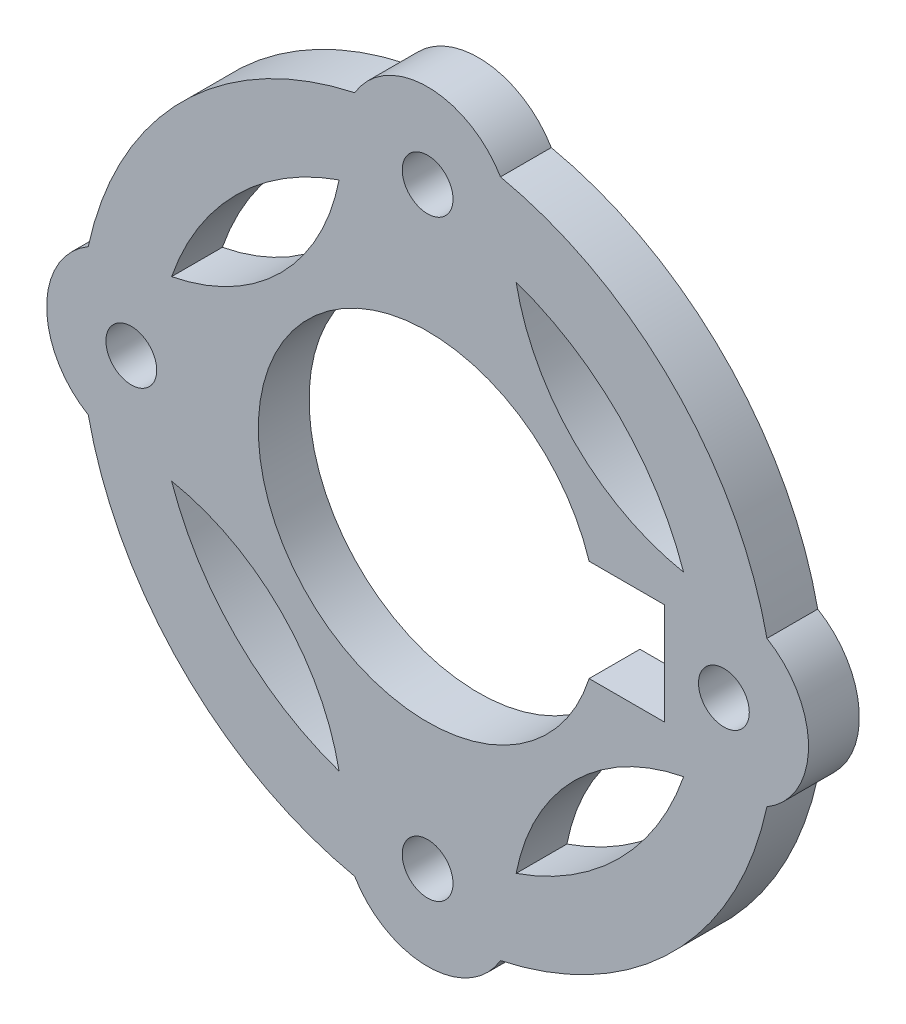
ISO-10303-21;
HEADER;
FILE_DESCRIPTION(('STEP AP214'),'2;1');
FILE_NAME('part.step','',(''),(''),'','','');
FILE_SCHEMA(('AUTOMOTIVE_DESIGN { 1 0 10303 214 1 1 1 1 }'));
ENDSEC;
DATA;
#1=APPLICATION_CONTEXT('core data for automotive mechanical design processes');
#2=APPLICATION_PROTOCOL_DEFINITION('international standard','automotive_design',2000,#1);
#3=PRODUCT_CONTEXT('',#1,'mechanical');
#4=PRODUCT('Part','Part','',(#3));
#5=PRODUCT_RELATED_PRODUCT_CATEGORY('part','',(#4));
#6=PRODUCT_DEFINITION_FORMATION('','',#4);
#7=PRODUCT_DEFINITION_CONTEXT('part definition',#1,'design');
#8=PRODUCT_DEFINITION('design','',#6,#7);
#9=PRODUCT_DEFINITION_SHAPE('','',#8);
#10=(LENGTH_UNIT() NAMED_UNIT(*) SI_UNIT(.MILLI.,.METRE.));
#11=(NAMED_UNIT(*) PLANE_ANGLE_UNIT() SI_UNIT($,.RADIAN.));
#12=(NAMED_UNIT(*) SI_UNIT($,.STERADIAN.) SOLID_ANGLE_UNIT());
#13=UNCERTAINTY_MEASURE_WITH_UNIT(LENGTH_MEASURE(1.E-05),#10,'distance_accuracy_value','');
#14=(GEOMETRIC_REPRESENTATION_CONTEXT(3) GLOBAL_UNCERTAINTY_ASSIGNED_CONTEXT((#13)) GLOBAL_UNIT_ASSIGNED_CONTEXT((#10,
#11,#12)) REPRESENTATION_CONTEXT('',''));
#15=CARTESIAN_POINT('',(0.,0.,0.));
#16=DIRECTION('',(0.,0.,1.));
#17=DIRECTION('',(1.,0.,0.));
#18=AXIS2_PLACEMENT_3D('',#15,#16,#17);
#19=CARTESIAN_POINT('',(0.,0.,3.));
#20=DIRECTION('',(0.,0.,-1.));
#21=DIRECTION('',(-1.,0.,0.));
#22=AXIS2_PLACEMENT_3D('',#19,#20,#21);
#23=CYLINDRICAL_SURFACE('',#22,10.);
#24=DIRECTION('',(0.,0.,-1.));
#25=VECTOR('',#24,1.);
#26=CARTESIAN_POINT('',(9.53939201416946,-3.,3.));
#27=LINE('',#26,#25);
#28=CARTESIAN_POINT('',(9.53939201416946,-3.,0.));
#29=VERTEX_POINT('',#28);
#30=CARTESIAN_POINT('',(9.53939201416946,-3.,3.));
#31=VERTEX_POINT('',#30);
#32=EDGE_CURVE('E539',#29,#31,#27,.F.);
#33=ORIENTED_EDGE('',*,*,#32,.F.);
#34=CARTESIAN_POINT('',(0.,0.,0.));
#35=DIRECTION('',(0.,0.,1.));
#36=DIRECTION('',(1.,0.,0.));
#37=AXIS2_PLACEMENT_3D('',#34,#35,#36);
#38=CIRCLE('',#37,10.);
#39=CARTESIAN_POINT('',(9.53939201416946,3.,0.));
#40=VERTEX_POINT('',#39);
#41=EDGE_CURVE('E470',#40,#29,#38,.T.);
#42=ORIENTED_EDGE('',*,*,#41,.F.);
#43=DIRECTION('',(0.,0.,-1.));
#44=VECTOR('',#43,1.);
#45=CARTESIAN_POINT('',(9.53939201416946,3.,3.));
#46=LINE('',#45,#44);
#47=CARTESIAN_POINT('',(9.53939201416946,3.,3.));
#48=VERTEX_POINT('',#47);
#49=EDGE_CURVE('E706',#48,#40,#46,.T.);
#50=ORIENTED_EDGE('',*,*,#49,.F.);
#51=CARTESIAN_POINT('',(0.,0.,3.));
#52=DIRECTION('',(0.,0.,1.));
#53=DIRECTION('',(1.,0.,0.));
#54=AXIS2_PLACEMENT_3D('',#51,#52,#53);
#55=CIRCLE('',#54,10.);
#56=EDGE_CURVE('E433',#48,#31,#55,.T.);
#57=ORIENTED_EDGE('',*,*,#56,.T.);
#58=EDGE_LOOP('',(#33,#42,#50,#57));
#59=FACE_BOUND('',#58,.T.);
#60=ADVANCED_FACE('F275',(#59),#23,.F.);
#61=CARTESIAN_POINT('',(0.,0.,3.));
#62=DIRECTION('',(0.,0.,-1.));
#63=DIRECTION('',(-1.,0.,0.));
#64=AXIS2_PLACEMENT_3D('',#61,#62,#63);
#65=CYLINDRICAL_SURFACE('',#64,16.);
#66=CARTESIAN_POINT('',(0.,0.,0.));
#67=DIRECTION('',(0.,0.,1.));
#68=DIRECTION('',(1.,0.,0.));
#69=AXIS2_PLACEMENT_3D('',#66,#67,#68);
#70=CIRCLE('',#69,16.);
#71=CARTESIAN_POINT('',(5.22834709121413,-15.1216529087859,0.));
#72=VERTEX_POINT('',#71);
#73=CARTESIAN_POINT('',(15.1216529087859,-5.22834709121412,0.));
#74=VERTEX_POINT('',#73);
#75=EDGE_CURVE('E467',#72,#74,#70,.T.);
#76=ORIENTED_EDGE('',*,*,#75,.F.);
#77=DIRECTION('',(0.,0.,-1.));
#78=VECTOR('',#77,1.);
#79=CARTESIAN_POINT('',(5.22834709121413,-15.1216529087859,3.));
#80=LINE('',#79,#78);
#81=CARTESIAN_POINT('',(5.22834709121413,-15.1216529087859,3.));
#82=VERTEX_POINT('',#81);
#83=EDGE_CURVE('E299',#82,#72,#80,.T.);
#84=ORIENTED_EDGE('',*,*,#83,.F.);
#85=CARTESIAN_POINT('',(0.,0.,3.));
#86=DIRECTION('',(0.,0.,1.));
#87=DIRECTION('',(1.,0.,0.));
#88=AXIS2_PLACEMENT_3D('',#85,#86,#87);
#89=CIRCLE('',#88,16.);
#90=CARTESIAN_POINT('',(15.1216529087859,-5.22834709121412,3.));
#91=VERTEX_POINT('',#90);
#92=EDGE_CURVE('E428',#82,#91,#89,.T.);
#93=ORIENTED_EDGE('',*,*,#92,.T.);
#94=DIRECTION('',(0.,0.,-1.));
#95=VECTOR('',#94,1.);
#96=CARTESIAN_POINT('',(15.1216529087859,-5.22834709121412,3.));
#97=LINE('',#96,#95);
#98=EDGE_CURVE('E283',#91,#74,#97,.T.);
#99=ORIENTED_EDGE('',*,*,#98,.T.);
#100=EDGE_LOOP('',(#76,#84,#93,#99));
#101=FACE_BOUND('',#100,.T.);
#102=ADVANCED_FACE('F619',(#101),#65,.F.);
#103=CARTESIAN_POINT('',(17.5000000000001,-17.5000000000001,3.));
#104=DIRECTION('',(0.,0.,-1.));
#105=DIRECTION('',(-1.,0.,0.));
#106=AXIS2_PLACEMENT_3D('',#103,#104,#105);
#107=CYLINDRICAL_SURFACE('',#106,12.5000000000001);
#108=CARTESIAN_POINT('',(17.5000000000001,-17.5000000000001,0.));
#109=DIRECTION('',(0.,0.,1.));
#110=DIRECTION('',(1.,0.,0.));
#111=AXIS2_PLACEMENT_3D('',#108,#109,#110);
#112=CIRCLE('',#111,12.5000000000001);
#113=EDGE_CURVE('E465',#74,#72,#112,.T.);
#114=ORIENTED_EDGE('',*,*,#113,.F.);
#115=ORIENTED_EDGE('',*,*,#98,.F.);
#116=CARTESIAN_POINT('',(17.5000000000001,-17.5000000000001,3.));
#117=DIRECTION('',(0.,0.,1.));
#118=DIRECTION('',(1.,0.,0.));
#119=AXIS2_PLACEMENT_3D('',#116,#117,#118);
#120=CIRCLE('',#119,12.5000000000001);
#121=EDGE_CURVE('E426',#91,#82,#120,.T.);
#122=ORIENTED_EDGE('',*,*,#121,.T.);
#123=ORIENTED_EDGE('',*,*,#83,.T.);
#124=EDGE_LOOP('',(#114,#115,#122,#123));
#125=FACE_BOUND('',#124,.T.);
#126=ADVANCED_FACE('F626',(#125),#107,.F.);
#127=CARTESIAN_POINT('',(-17.5000000000001,-17.5000000000001,3.));
#128=DIRECTION('',(0.,0.,-1.));
#129=DIRECTION('',(-1.,0.,0.));
#130=AXIS2_PLACEMENT_3D('',#127,#128,#129);
#131=CYLINDRICAL_SURFACE('',#130,12.5000000000001);
#132=CARTESIAN_POINT('',(-17.5000000000001,-17.5000000000001,0.));
#133=DIRECTION('',(0.,0.,1.));
#134=DIRECTION('',(1.,0.,0.));
#135=AXIS2_PLACEMENT_3D('',#132,#133,#134);
#136=CIRCLE('',#135,12.5000000000001);
#137=CARTESIAN_POINT('',(-5.22834709121413,-15.1216529087859,0.));
#138=VERTEX_POINT('',#137);
#139=CARTESIAN_POINT('',(-15.1216529087859,-5.22834709121413,0.));
#140=VERTEX_POINT('',#139);
#141=EDGE_CURVE('E411',#138,#140,#136,.T.);
#142=ORIENTED_EDGE('',*,*,#141,.F.);
#143=DIRECTION('',(0.,0.,-1.));
#144=VECTOR('',#143,1.);
#145=CARTESIAN_POINT('',(-5.22834709121413,-15.1216529087859,3.));
#146=LINE('',#145,#144);
#147=CARTESIAN_POINT('',(-5.22834709121413,-15.1216529087859,3.));
#148=VERTEX_POINT('',#147);
#149=EDGE_CURVE('E405',#148,#138,#146,.T.);
#150=ORIENTED_EDGE('',*,*,#149,.F.);
#151=CARTESIAN_POINT('',(-17.5000000000001,-17.5000000000001,3.));
#152=DIRECTION('',(0.,0.,1.));
#153=DIRECTION('',(1.,0.,0.));
#154=AXIS2_PLACEMENT_3D('',#151,#152,#153);
#155=CIRCLE('',#154,12.5000000000001);
#156=CARTESIAN_POINT('',(-15.1216529087859,-5.22834709121413,3.));
#157=VERTEX_POINT('',#156);
#158=EDGE_CURVE('E409',#148,#157,#155,.T.);
#159=ORIENTED_EDGE('',*,*,#158,.T.);
#160=DIRECTION('',(0.,0.,-1.));
#161=VECTOR('',#160,1.);
#162=CARTESIAN_POINT('',(-15.1216529087859,-5.22834709121413,3.));
#163=LINE('',#162,#161);
#164=EDGE_CURVE('E415',#157,#140,#163,.T.);
#165=ORIENTED_EDGE('',*,*,#164,.T.);
#166=EDGE_LOOP('',(#142,#150,#159,#165));
#167=FACE_BOUND('',#166,.T.);
#168=ADVANCED_FACE('F407',(#167),#131,.F.);
#169=CARTESIAN_POINT('',(0.,0.,3.));
#170=DIRECTION('',(0.,0.,-1.));
#171=DIRECTION('',(-1.,0.,0.));
#172=AXIS2_PLACEMENT_3D('',#169,#170,#171);
#173=CYLINDRICAL_SURFACE('',#172,16.);
#174=CARTESIAN_POINT('',(0.,0.,0.));
#175=DIRECTION('',(0.,0.,1.));
#176=DIRECTION('',(1.,0.,0.));
#177=AXIS2_PLACEMENT_3D('',#174,#175,#176);
#178=CIRCLE('',#177,16.);
#179=EDGE_CURVE('E462',#140,#138,#178,.T.);
#180=ORIENTED_EDGE('',*,*,#179,.F.);
#181=ORIENTED_EDGE('',*,*,#164,.F.);
#182=CARTESIAN_POINT('',(0.,0.,3.));
#183=DIRECTION('',(0.,0.,1.));
#184=DIRECTION('',(1.,0.,0.));
#185=AXIS2_PLACEMENT_3D('',#182,#183,#184);
#186=CIRCLE('',#185,16.);
#187=EDGE_CURVE('E419',#157,#148,#186,.T.);
#188=ORIENTED_EDGE('',*,*,#187,.T.);
#189=ORIENTED_EDGE('',*,*,#149,.T.);
#190=EDGE_LOOP('',(#180,#181,#188,#189));
#191=FACE_BOUND('',#190,.T.);
#192=ADVANCED_FACE('F420',(#191),#173,.F.);
#193=CARTESIAN_POINT('',(17.5,17.5,3.));
#194=DIRECTION('',(0.,0.,-1.));
#195=DIRECTION('',(-1.,0.,0.));
#196=AXIS2_PLACEMENT_3D('',#193,#194,#195);
#197=CYLINDRICAL_SURFACE('',#196,12.5);
#198=CARTESIAN_POINT('',(17.5,17.5,0.));
#199=DIRECTION('',(0.,0.,1.));
#200=DIRECTION('',(1.,0.,0.));
#201=AXIS2_PLACEMENT_3D('',#198,#199,#200);
#202=CIRCLE('',#201,12.5);
#203=CARTESIAN_POINT('',(5.22834709121411,15.1216529087859,0.));
#204=VERTEX_POINT('',#203);
#205=CARTESIAN_POINT('',(15.1216529087859,5.22834709121411,0.));
#206=VERTEX_POINT('',#205);
#207=EDGE_CURVE('E459',#204,#206,#202,.T.);
#208=ORIENTED_EDGE('',*,*,#207,.F.);
#209=DIRECTION('',(0.,0.,-1.));
#210=VECTOR('',#209,1.);
#211=CARTESIAN_POINT('',(5.22834709121411,15.1216529087859,3.));
#212=LINE('',#211,#210);
#213=CARTESIAN_POINT('',(5.22834709121411,15.1216529087859,3.));
#214=VERTEX_POINT('',#213);
#215=EDGE_CURVE('E477',#214,#204,#212,.T.);
#216=ORIENTED_EDGE('',*,*,#215,.F.);
#217=CARTESIAN_POINT('',(17.5,17.5,3.));
#218=DIRECTION('',(0.,0.,1.));
#219=DIRECTION('',(1.,0.,0.));
#220=AXIS2_PLACEMENT_3D('',#217,#218,#219);
#221=CIRCLE('',#220,12.5);
#222=CARTESIAN_POINT('',(15.1216529087859,5.22834709121411,3.));
#223=VERTEX_POINT('',#222);
#224=EDGE_CURVE('E422',#214,#223,#221,.T.);
#225=ORIENTED_EDGE('',*,*,#224,.T.);
#226=DIRECTION('',(0.,0.,-1.));
#227=VECTOR('',#226,1.);
#228=CARTESIAN_POINT('',(15.1216529087859,5.22834709121411,3.));
#229=LINE('',#228,#227);
#230=EDGE_CURVE('E416',#223,#206,#229,.T.);
#231=ORIENTED_EDGE('',*,*,#230,.T.);
#232=EDGE_LOOP('',(#208,#216,#225,#231));
#233=FACE_BOUND('',#232,.T.);
#234=ADVANCED_FACE('F576',(#233),#197,.F.);
#235=CARTESIAN_POINT('',(0.,0.,3.));
#236=DIRECTION('',(0.,0.,-1.));
#237=DIRECTION('',(-1.,0.,0.));
#238=AXIS2_PLACEMENT_3D('',#235,#236,#237);
#239=CYLINDRICAL_SURFACE('',#238,16.);
#240=CARTESIAN_POINT('',(0.,0.,0.));
#241=DIRECTION('',(0.,0.,1.));
#242=DIRECTION('',(1.,0.,0.));
#243=AXIS2_PLACEMENT_3D('',#240,#241,#242);
#244=CIRCLE('',#243,16.);
#245=EDGE_CURVE('E456',#206,#204,#244,.T.);
#246=ORIENTED_EDGE('',*,*,#245,.F.);
#247=ORIENTED_EDGE('',*,*,#230,.F.);
#248=CARTESIAN_POINT('',(0.,0.,3.));
#249=DIRECTION('',(0.,0.,1.));
#250=DIRECTION('',(1.,0.,0.));
#251=AXIS2_PLACEMENT_3D('',#248,#249,#250);
#252=CIRCLE('',#251,16.);
#253=EDGE_CURVE('E570',#223,#214,#252,.T.);
#254=ORIENTED_EDGE('',*,*,#253,.T.);
#255=ORIENTED_EDGE('',*,*,#215,.T.);
#256=EDGE_LOOP('',(#246,#247,#254,#255));
#257=FACE_BOUND('',#256,.T.);
#258=ADVANCED_FACE('F581',(#257),#239,.F.);
#259=CARTESIAN_POINT('',(-17.5,17.5,3.));
#260=DIRECTION('',(0.,0.,-1.));
#261=DIRECTION('',(-1.,0.,0.));
#262=AXIS2_PLACEMENT_3D('',#259,#260,#261);
#263=CYLINDRICAL_SURFACE('',#262,12.5);
#264=CARTESIAN_POINT('',(-17.5,17.5,0.));
#265=DIRECTION('',(0.,0.,1.));
#266=DIRECTION('',(1.,0.,0.));
#267=AXIS2_PLACEMENT_3D('',#264,#265,#266);
#268=CIRCLE('',#267,12.5);
#269=CARTESIAN_POINT('',(-5.22834709121411,15.1216529087859,0.));
#270=VERTEX_POINT('',#269);
#271=CARTESIAN_POINT('',(-15.1216529087859,5.22834709121411,0.));
#272=VERTEX_POINT('',#271);
#273=EDGE_CURVE('E453',#270,#272,#268,.F.);
#274=ORIENTED_EDGE('',*,*,#273,.T.);
#275=DIRECTION('',(0.,0.,-1.));
#276=VECTOR('',#275,1.);
#277=CARTESIAN_POINT('',(-15.1216529087859,5.22834709121411,3.));
#278=LINE('',#277,#276);
#279=CARTESIAN_POINT('',(-15.1216529087859,5.22834709121411,3.));
#280=VERTEX_POINT('',#279);
#281=EDGE_CURVE('E481',#280,#272,#278,.T.);
#282=ORIENTED_EDGE('',*,*,#281,.F.);
#283=CARTESIAN_POINT('',(-17.5,17.5,3.));
#284=DIRECTION('',(0.,0.,1.));
#285=DIRECTION('',(1.,0.,0.));
#286=AXIS2_PLACEMENT_3D('',#283,#284,#285);
#287=CIRCLE('',#286,12.5);
#288=CARTESIAN_POINT('',(-5.22834709121411,15.1216529087859,3.));
#289=VERTEX_POINT('',#288);
#290=EDGE_CURVE('E562',#289,#280,#287,.F.);
#291=ORIENTED_EDGE('',*,*,#290,.F.);
#292=DIRECTION('',(0.,0.,-1.));
#293=VECTOR('',#292,1.);
#294=CARTESIAN_POINT('',(-5.22834709121411,15.1216529087859,3.));
#295=LINE('',#294,#293);
#296=EDGE_CURVE('E479',#289,#270,#295,.T.);
#297=ORIENTED_EDGE('',*,*,#296,.T.);
#298=EDGE_LOOP('',(#274,#282,#291,#297));
#299=FACE_BOUND('',#298,.T.);
#300=ADVANCED_FACE('F641',(#299),#263,.F.);
#301=CARTESIAN_POINT('',(0.,0.,3.));
#302=DIRECTION('',(0.,0.,-1.));
#303=DIRECTION('',(-1.,0.,0.));
#304=AXIS2_PLACEMENT_3D('',#301,#302,#303);
#305=CYLINDRICAL_SURFACE('',#304,16.);
#306=CARTESIAN_POINT('',(0.,0.,0.));
#307=DIRECTION('',(0.,0.,1.));
#308=DIRECTION('',(1.,0.,0.));
#309=AXIS2_PLACEMENT_3D('',#306,#307,#308);
#310=CIRCLE('',#309,16.);
#311=EDGE_CURVE('E450',#270,#272,#310,.T.);
#312=ORIENTED_EDGE('',*,*,#311,.F.);
#313=ORIENTED_EDGE('',*,*,#296,.F.);
#314=CARTESIAN_POINT('',(0.,0.,3.));
#315=DIRECTION('',(0.,0.,1.));
#316=DIRECTION('',(1.,0.,0.));
#317=AXIS2_PLACEMENT_3D('',#314,#315,#316);
#318=CIRCLE('',#317,16.);
#319=EDGE_CURVE('E558',#289,#280,#318,.T.);
#320=ORIENTED_EDGE('',*,*,#319,.T.);
#321=ORIENTED_EDGE('',*,*,#281,.T.);
#322=EDGE_LOOP('',(#312,#313,#320,#321));
#323=FACE_BOUND('',#322,.T.);
#324=ADVANCED_FACE('F644',(#323),#305,.F.);
#325=CARTESIAN_POINT('',(0.,0.,3.));
#326=DIRECTION('',(0.,0.,-1.));
#327=DIRECTION('',(-1.,0.,0.));
#328=AXIS2_PLACEMENT_3D('',#325,#326,#327);
#329=CYLINDRICAL_SURFACE('',#328,20.5);
#330=CARTESIAN_POINT('',(0.,0.,0.));
#331=DIRECTION('',(0.,0.,1.));
#332=DIRECTION('',(1.,0.,0.));
#333=AXIS2_PLACEMENT_3D('',#330,#331,#332);
#334=CIRCLE('',#333,20.5);
#335=CARTESIAN_POINT('',(20.0428571428572,4.30509901756282,0.));
#336=VERTEX_POINT('',#335);
#337=CARTESIAN_POINT('',(4.30509901756283,20.0428571428572,0.));
#338=VERTEX_POINT('',#337);
#339=EDGE_CURVE('E437',#336,#338,#334,.T.);
#340=ORIENTED_EDGE('',*,*,#339,.T.);
#341=DIRECTION('',(0.,0.,-1.));
#342=VECTOR('',#341,1.);
#343=CARTESIAN_POINT('',(4.30509901756283,20.0428571428572,3.));
#344=LINE('',#343,#342);
#345=CARTESIAN_POINT('',(4.30509901756283,20.0428571428572,3.));
#346=VERTEX_POINT('',#345);
#347=EDGE_CURVE('E495',#346,#338,#344,.T.);
#348=ORIENTED_EDGE('',*,*,#347,.F.);
#349=CARTESIAN_POINT('',(0.,0.,3.));
#350=DIRECTION('',(0.,0.,1.));
#351=DIRECTION('',(1.,0.,0.));
#352=AXIS2_PLACEMENT_3D('',#349,#350,#351);
#353=CIRCLE('',#352,20.5);
#354=CARTESIAN_POINT('',(20.0428571428572,4.30509901756282,3.));
#355=VERTEX_POINT('',#354);
#356=EDGE_CURVE('E473',#355,#346,#353,.T.);
#357=ORIENTED_EDGE('',*,*,#356,.F.);
#358=DIRECTION('',(0.,0.,-1.));
#359=VECTOR('',#358,1.);
#360=CARTESIAN_POINT('',(20.0428571428572,4.30509901756282,3.));
#361=LINE('',#360,#359);
#362=EDGE_CURVE('E362',#355,#336,#361,.T.);
#363=ORIENTED_EDGE('',*,*,#362,.T.);
#364=EDGE_LOOP('',(#340,#348,#357,#363));
#365=FACE_BOUND('',#364,.T.);
#366=ADVANCED_FACE('F648',(#365),#329,.T.);
#367=CARTESIAN_POINT('',(0.,0.,3.));
#368=DIRECTION('',(0.,0.,-1.));
#369=DIRECTION('',(-1.,0.,0.));
#370=AXIS2_PLACEMENT_3D('',#367,#368,#369);
#371=CYLINDRICAL_SURFACE('',#370,20.5);
#372=CARTESIAN_POINT('',(0.,0.,0.));
#373=DIRECTION('',(0.,0.,1.));
#374=DIRECTION('',(1.,0.,0.));
#375=AXIS2_PLACEMENT_3D('',#372,#373,#374);
#376=CIRCLE('',#375,20.5);
#377=CARTESIAN_POINT('',(-4.30509901756283,20.0428571428572,0.));
#378=VERTEX_POINT('',#377);
#379=CARTESIAN_POINT('',(-20.0428571428572,4.30509901756282,0.));
#380=VERTEX_POINT('',#379);
#381=EDGE_CURVE('E440',#378,#380,#376,.T.);
#382=ORIENTED_EDGE('',*,*,#381,.T.);
#383=DIRECTION('',(0.,0.,-1.));
#384=VECTOR('',#383,1.);
#385=CARTESIAN_POINT('',(-20.0428571428572,4.30509901756282,3.));
#386=LINE('',#385,#384);
#387=CARTESIAN_POINT('',(-20.0428571428572,4.30509901756282,3.));
#388=VERTEX_POINT('',#387);
#389=EDGE_CURVE('E491',#388,#380,#386,.T.);
#390=ORIENTED_EDGE('',*,*,#389,.F.);
#391=CARTESIAN_POINT('',(0.,0.,3.));
#392=DIRECTION('',(0.,0.,1.));
#393=DIRECTION('',(1.,0.,0.));
#394=AXIS2_PLACEMENT_3D('',#391,#392,#393);
#395=CIRCLE('',#394,20.5);
#396=CARTESIAN_POINT('',(-4.30509901756283,20.0428571428572,3.));
#397=VERTEX_POINT('',#396);
#398=EDGE_CURVE('E565',#397,#388,#395,.T.);
#399=ORIENTED_EDGE('',*,*,#398,.F.);
#400=DIRECTION('',(0.,0.,-1.));
#401=VECTOR('',#400,1.);
#402=CARTESIAN_POINT('',(-4.30509901756283,20.0428571428572,3.));
#403=LINE('',#402,#401);
#404=EDGE_CURVE('E493',#397,#378,#403,.T.);
#405=ORIENTED_EDGE('',*,*,#404,.T.);
#406=EDGE_LOOP('',(#382,#390,#399,#405));
#407=FACE_BOUND('',#406,.T.);
#408=ADVANCED_FACE('F655',(#407),#371,.T.);
#409=CARTESIAN_POINT('',(0.,0.,3.));
#410=DIRECTION('',(0.,0.,-1.));
#411=DIRECTION('',(-1.,0.,0.));
#412=AXIS2_PLACEMENT_3D('',#409,#410,#411);
#413=CYLINDRICAL_SURFACE('',#412,20.5);
#414=CARTESIAN_POINT('',(0.,0.,0.));
#415=DIRECTION('',(0.,0.,1.));
#416=DIRECTION('',(1.,0.,0.));
#417=AXIS2_PLACEMENT_3D('',#414,#415,#416);
#418=CIRCLE('',#417,20.5);
#419=CARTESIAN_POINT('',(-20.0428571428572,-4.30509901756282,0.));
#420=VERTEX_POINT('',#419);
#421=CARTESIAN_POINT('',(-4.30509901756283,-20.0428571428572,0.));
#422=VERTEX_POINT('',#421);
#423=EDGE_CURVE('E444',#420,#422,#418,.T.);
#424=ORIENTED_EDGE('',*,*,#423,.T.);
#425=DIRECTION('',(0.,0.,-1.));
#426=VECTOR('',#425,1.);
#427=CARTESIAN_POINT('',(-4.30509901756283,-20.0428571428572,3.));
#428=LINE('',#427,#426);
#429=CARTESIAN_POINT('',(-4.30509901756283,-20.0428571428572,3.));
#430=VERTEX_POINT('',#429);
#431=EDGE_CURVE('E487',#430,#422,#428,.T.);
#432=ORIENTED_EDGE('',*,*,#431,.F.);
#433=CARTESIAN_POINT('',(0.,0.,3.));
#434=DIRECTION('',(0.,0.,1.));
#435=DIRECTION('',(1.,0.,0.));
#436=AXIS2_PLACEMENT_3D('',#433,#434,#435);
#437=CIRCLE('',#436,20.5);
#438=CARTESIAN_POINT('',(-20.0428571428572,-4.30509901756282,3.));
#439=VERTEX_POINT('',#438);
#440=EDGE_CURVE('E559',#439,#430,#437,.T.);
#441=ORIENTED_EDGE('',*,*,#440,.F.);
#442=DIRECTION('',(0.,0.,-1.));
#443=VECTOR('',#442,1.);
#444=CARTESIAN_POINT('',(-20.0428571428572,-4.30509901756282,3.));
#445=LINE('',#444,#443);
#446=EDGE_CURVE('E489',#439,#420,#445,.T.);
#447=ORIENTED_EDGE('',*,*,#446,.T.);
#448=EDGE_LOOP('',(#424,#432,#441,#447));
#449=FACE_BOUND('',#448,.T.);
#450=ADVANCED_FACE('F652',(#449),#413,.T.);
#451=CARTESIAN_POINT('',(0.,0.,3.));
#452=DIRECTION('',(0.,0.,-1.));
#453=DIRECTION('',(-1.,0.,0.));
#454=AXIS2_PLACEMENT_3D('',#451,#452,#453);
#455=CYLINDRICAL_SURFACE('',#454,20.5);
#456=CARTESIAN_POINT('',(0.,0.,0.));
#457=DIRECTION('',(0.,0.,1.));
#458=DIRECTION('',(1.,0.,0.));
#459=AXIS2_PLACEMENT_3D('',#456,#457,#458);
#460=CIRCLE('',#459,20.5);
#461=CARTESIAN_POINT('',(4.30509901756283,-20.0428571428572,0.));
#462=VERTEX_POINT('',#461);
#463=CARTESIAN_POINT('',(20.0428571428572,-4.30509901756282,0.));
#464=VERTEX_POINT('',#463);
#465=EDGE_CURVE('E447',#462,#464,#460,.T.);
#466=ORIENTED_EDGE('',*,*,#465,.T.);
#467=DIRECTION('',(0.,0.,-1.));
#468=VECTOR('',#467,1.);
#469=CARTESIAN_POINT('',(20.0428571428572,-4.30509901756282,3.));
#470=LINE('',#469,#468);
#471=CARTESIAN_POINT('',(20.0428571428572,-4.30509901756282,3.));
#472=VERTEX_POINT('',#471);
#473=EDGE_CURVE('E436',#472,#464,#470,.T.);
#474=ORIENTED_EDGE('',*,*,#473,.F.);
#475=CARTESIAN_POINT('',(0.,0.,3.));
#476=DIRECTION('',(0.,0.,1.));
#477=DIRECTION('',(1.,0.,0.));
#478=AXIS2_PLACEMENT_3D('',#475,#476,#477);
#479=CIRCLE('',#478,20.5);
#480=CARTESIAN_POINT('',(4.30509901756283,-20.0428571428572,3.));
#481=VERTEX_POINT('',#480);
#482=EDGE_CURVE('E556',#481,#472,#479,.T.);
#483=ORIENTED_EDGE('',*,*,#482,.F.);
#484=DIRECTION('',(0.,0.,-1.));
#485=VECTOR('',#484,1.);
#486=CARTESIAN_POINT('',(4.30509901756283,-20.0428571428572,3.));
#487=LINE('',#486,#485);
#488=EDGE_CURVE('E485',#481,#462,#487,.T.);
#489=ORIENTED_EDGE('',*,*,#488,.T.);
#490=EDGE_LOOP('',(#466,#474,#483,#489));
#491=FACE_BOUND('',#490,.T.);
#492=ADVANCED_FACE('F553',(#491),#455,.T.);
#493=CARTESIAN_POINT('',(0.,0.,0.));
#494=DIRECTION('',(0.,0.,1.));
#495=DIRECTION('',(1.,0.,0.));
#496=AXIS2_PLACEMENT_3D('',#493,#494,#495);
#497=PLANE('',#496);
#498=ORIENTED_EDGE('',*,*,#339,.F.);
#499=CARTESIAN_POINT('',(17.5,0.,0.));
#500=DIRECTION('',(0.,0.,1.));
#501=DIRECTION('',(1.,0.,0.));
#502=AXIS2_PLACEMENT_3D('',#499,#500,#501);
#503=CIRCLE('',#502,5.);
#504=EDGE_CURVE('E525',#464,#336,#503,.T.);
#505=ORIENTED_EDGE('',*,*,#504,.F.);
#506=ORIENTED_EDGE('',*,*,#465,.F.);
#507=CARTESIAN_POINT('',(0.,-17.5,0.));
#508=DIRECTION('',(0.,0.,1.));
#509=DIRECTION('',(1.,0.,0.));
#510=AXIS2_PLACEMENT_3D('',#507,#508,#509);
#511=CIRCLE('',#510,5.);
#512=EDGE_CURVE('E535',#422,#462,#511,.T.);
#513=ORIENTED_EDGE('',*,*,#512,.F.);
#514=ORIENTED_EDGE('',*,*,#423,.F.);
#515=CARTESIAN_POINT('',(-17.5,0.,0.));
#516=DIRECTION('',(0.,0.,1.));
#517=DIRECTION('',(1.,0.,0.));
#518=AXIS2_PLACEMENT_3D('',#515,#516,#517);
#519=CIRCLE('',#518,5.);
#520=EDGE_CURVE('E501',#380,#420,#519,.T.);
#521=ORIENTED_EDGE('',*,*,#520,.F.);
#522=ORIENTED_EDGE('',*,*,#381,.F.);
#523=CARTESIAN_POINT('',(0.,17.5,0.));
#524=DIRECTION('',(0.,0.,1.));
#525=DIRECTION('',(1.,0.,0.));
#526=AXIS2_PLACEMENT_3D('',#523,#524,#525);
#527=CIRCLE('',#526,5.);
#528=EDGE_CURVE('E513',#338,#378,#527,.T.);
#529=ORIENTED_EDGE('',*,*,#528,.F.);
#530=EDGE_LOOP('',(#498,#505,#506,#513,#514,#521,#522,#529));
#531=FACE_BOUND('',#530,.T.);
#532=ORIENTED_EDGE('',*,*,#311,.T.);
#533=ORIENTED_EDGE('',*,*,#273,.F.);
#534=EDGE_LOOP('',(#532,#533));
#535=FACE_BOUND('',#534,.T.);
#536=ORIENTED_EDGE('',*,*,#245,.T.);
#537=ORIENTED_EDGE('',*,*,#207,.T.);
#538=EDGE_LOOP('',(#536,#537));
#539=FACE_BOUND('',#538,.T.);
#540=ORIENTED_EDGE('',*,*,#179,.T.);
#541=ORIENTED_EDGE('',*,*,#141,.T.);
#542=EDGE_LOOP('',(#540,#541));
#543=FACE_BOUND('',#542,.T.);
#544=ORIENTED_EDGE('',*,*,#113,.T.);
#545=ORIENTED_EDGE('',*,*,#75,.T.);
#546=EDGE_LOOP('',(#544,#545));
#547=FACE_BOUND('',#546,.T.);
#548=ORIENTED_EDGE('',*,*,#41,.T.);
#549=DIRECTION('',(-1.,0.,0.));
#550=VECTOR('',#549,1.);
#551=CARTESIAN_POINT('',(14.,-3.,0.));
#552=LINE('',#551,#550);
#553=CARTESIAN_POINT('',(14.,-3.,0.));
#554=VERTEX_POINT('',#553);
#555=EDGE_CURVE('E705',#554,#29,#552,.T.);
#556=ORIENTED_EDGE('',*,*,#555,.F.);
#557=DIRECTION('',(0.,-1.,0.));
#558=VECTOR('',#557,1.);
#559=CARTESIAN_POINT('',(14.,3.,0.));
#560=LINE('',#559,#558);
#561=CARTESIAN_POINT('',(14.,3.,0.));
#562=VERTEX_POINT('',#561);
#563=EDGE_CURVE('E741',#562,#554,#560,.T.);
#564=ORIENTED_EDGE('',*,*,#563,.F.);
#565=DIRECTION('',(1.,0.,0.));
#566=VECTOR('',#565,1.);
#567=CARTESIAN_POINT('',(14.,3.,0.));
#568=LINE('',#567,#566);
#569=EDGE_CURVE('E744',#40,#562,#568,.T.);
#570=ORIENTED_EDGE('',*,*,#569,.F.);
#571=EDGE_LOOP('',(#548,#556,#564,#570));
#572=FACE_BOUND('',#571,.T.);
#573=CARTESIAN_POINT('',(0.,-17.5,0.));
#574=DIRECTION('',(0.,0.,1.));
#575=DIRECTION('',(1.,0.,0.));
#576=AXIS2_PLACEMENT_3D('',#573,#574,#575);
#577=CIRCLE('',#576,1.5);
#578=CARTESIAN_POINT('',(1.5,-17.5,0.));
#579=VERTEX_POINT('',#578);
#580=EDGE_CURVE('E536',#579,#579,#577,.T.);
#581=ORIENTED_EDGE('',*,*,#580,.T.);
#582=EDGE_LOOP('',(#581));
#583=FACE_BOUND('',#582,.T.);
#584=CARTESIAN_POINT('',(-17.5,0.,0.));
#585=DIRECTION('',(0.,0.,1.));
#586=DIRECTION('',(1.,0.,0.));
#587=AXIS2_PLACEMENT_3D('',#584,#585,#586);
#588=CIRCLE('',#587,1.5);
#589=CARTESIAN_POINT('',(-16.,0.,0.));
#590=VERTEX_POINT('',#589);
#591=EDGE_CURVE('E502',#590,#590,#588,.T.);
#592=ORIENTED_EDGE('',*,*,#591,.T.);
#593=EDGE_LOOP('',(#592));
#594=FACE_BOUND('',#593,.T.);
#595=CARTESIAN_POINT('',(0.,17.5,0.));
#596=DIRECTION('',(0.,0.,1.));
#597=DIRECTION('',(1.,0.,0.));
#598=AXIS2_PLACEMENT_3D('',#595,#596,#597);
#599=CIRCLE('',#598,1.5);
#600=CARTESIAN_POINT('',(1.5,17.5,0.));
#601=VERTEX_POINT('',#600);
#602=EDGE_CURVE('E514',#601,#601,#599,.T.);
#603=ORIENTED_EDGE('',*,*,#602,.T.);
#604=EDGE_LOOP('',(#603));
#605=FACE_BOUND('',#604,.T.);
#606=CARTESIAN_POINT('',(17.5,0.,0.));
#607=DIRECTION('',(0.,0.,1.));
#608=DIRECTION('',(1.,0.,0.));
#609=AXIS2_PLACEMENT_3D('',#606,#607,#608);
#610=CIRCLE('',#609,1.5);
#611=CARTESIAN_POINT('',(19.,0.,0.));
#612=VERTEX_POINT('',#611);
#613=EDGE_CURVE('E526',#612,#612,#610,.T.);
#614=ORIENTED_EDGE('',*,*,#613,.T.);
#615=EDGE_LOOP('',(#614));
#616=FACE_BOUND('',#615,.T.);
#617=ADVANCED_FACE('F550',(#531,#535,#539,#543,#547,#572,#583,#594,#605,#616),#497,.F.);
#618=CARTESIAN_POINT('',(0.,0.,3.));
#619=DIRECTION('',(0.,0.,1.));
#620=DIRECTION('',(1.,0.,0.));
#621=AXIS2_PLACEMENT_3D('',#618,#619,#620);
#622=PLANE('',#621);
#623=DIRECTION('',(-1.,0.,0.));
#624=VECTOR('',#623,1.);
#625=CARTESIAN_POINT('',(14.,-3.,3.));
#626=LINE('',#625,#624);
#627=CARTESIAN_POINT('',(14.,-3.,3.));
#628=VERTEX_POINT('',#627);
#629=EDGE_CURVE('E704',#628,#31,#626,.T.);
#630=ORIENTED_EDGE('',*,*,#629,.T.);
#631=ORIENTED_EDGE('',*,*,#56,.F.);
#632=DIRECTION('',(-1.,0.,0.));
#633=VECTOR('',#632,1.);
#634=CARTESIAN_POINT('',(0.,3.,3.));
#635=LINE('',#634,#633);
#636=CARTESIAN_POINT('',(14.,3.,3.));
#637=VERTEX_POINT('',#636);
#638=EDGE_CURVE('E12',#637,#48,#635,.T.);
#639=ORIENTED_EDGE('',*,*,#638,.F.);
#640=DIRECTION('',(0.,-1.,0.));
#641=VECTOR('',#640,1.);
#642=CARTESIAN_POINT('',(14.,3.,3.));
#643=LINE('',#642,#641);
#644=EDGE_CURVE('E290',#637,#628,#643,.T.);
#645=ORIENTED_EDGE('',*,*,#644,.T.);
#646=EDGE_LOOP('',(#630,#631,#639,#645));
#647=FACE_BOUND('',#646,.T.);
#648=ORIENTED_EDGE('',*,*,#482,.T.);
#649=CARTESIAN_POINT('',(17.5,0.,3.));
#650=DIRECTION('',(0.,0.,1.));
#651=DIRECTION('',(1.,0.,0.));
#652=AXIS2_PLACEMENT_3D('',#649,#650,#651);
#653=CIRCLE('',#652,5.);
#654=EDGE_CURVE('E517',#472,#355,#653,.T.);
#655=ORIENTED_EDGE('',*,*,#654,.T.);
#656=ORIENTED_EDGE('',*,*,#356,.T.);
#657=CARTESIAN_POINT('',(0.,17.5,3.));
#658=DIRECTION('',(0.,0.,1.));
#659=DIRECTION('',(1.,0.,0.));
#660=AXIS2_PLACEMENT_3D('',#657,#658,#659);
#661=CIRCLE('',#660,5.);
#662=EDGE_CURVE('E505',#346,#397,#661,.T.);
#663=ORIENTED_EDGE('',*,*,#662,.T.);
#664=ORIENTED_EDGE('',*,*,#398,.T.);
#665=CARTESIAN_POINT('',(-17.5,0.,3.));
#666=DIRECTION('',(0.,0.,1.));
#667=DIRECTION('',(1.,0.,0.));
#668=AXIS2_PLACEMENT_3D('',#665,#666,#667);
#669=CIRCLE('',#668,5.);
#670=EDGE_CURVE('E441',#388,#439,#669,.T.);
#671=ORIENTED_EDGE('',*,*,#670,.T.);
#672=ORIENTED_EDGE('',*,*,#440,.T.);
#673=CARTESIAN_POINT('',(0.,-17.5,3.));
#674=DIRECTION('',(0.,0.,1.));
#675=DIRECTION('',(1.,0.,0.));
#676=AXIS2_PLACEMENT_3D('',#673,#674,#675);
#677=CIRCLE('',#676,5.);
#678=EDGE_CURVE('E529',#430,#481,#677,.T.);
#679=ORIENTED_EDGE('',*,*,#678,.T.);
#680=EDGE_LOOP('',(#648,#655,#656,#663,#664,#671,#672,#679));
#681=FACE_BOUND('',#680,.T.);
#682=ORIENTED_EDGE('',*,*,#319,.F.);
#683=ORIENTED_EDGE('',*,*,#290,.T.);
#684=EDGE_LOOP('',(#682,#683));
#685=FACE_BOUND('',#684,.T.);
#686=ORIENTED_EDGE('',*,*,#253,.F.);
#687=ORIENTED_EDGE('',*,*,#224,.F.);
#688=EDGE_LOOP('',(#686,#687));
#689=FACE_BOUND('',#688,.T.);
#690=ORIENTED_EDGE('',*,*,#187,.F.);
#691=ORIENTED_EDGE('',*,*,#158,.F.);
#692=EDGE_LOOP('',(#690,#691));
#693=FACE_BOUND('',#692,.T.);
#694=ORIENTED_EDGE('',*,*,#121,.F.);
#695=ORIENTED_EDGE('',*,*,#92,.F.);
#696=EDGE_LOOP('',(#694,#695));
#697=FACE_BOUND('',#696,.T.);
#698=CARTESIAN_POINT('',(0.,-17.5,3.));
#699=DIRECTION('',(0.,0.,1.));
#700=DIRECTION('',(1.,0.,0.));
#701=AXIS2_PLACEMENT_3D('',#698,#699,#700);
#702=CIRCLE('',#701,1.5);
#703=CARTESIAN_POINT('',(1.5,-17.5,3.));
#704=VERTEX_POINT('',#703);
#705=EDGE_CURVE('E532',#704,#704,#702,.T.);
#706=ORIENTED_EDGE('',*,*,#705,.F.);
#707=EDGE_LOOP('',(#706));
#708=FACE_BOUND('',#707,.T.);
#709=CARTESIAN_POINT('',(-17.5,0.,3.));
#710=DIRECTION('',(0.,0.,1.));
#711=DIRECTION('',(1.,0.,0.));
#712=AXIS2_PLACEMENT_3D('',#709,#710,#711);
#713=CIRCLE('',#712,1.5);
#714=CARTESIAN_POINT('',(-16.,0.,3.));
#715=VERTEX_POINT('',#714);
#716=EDGE_CURVE('E498',#715,#715,#713,.T.);
#717=ORIENTED_EDGE('',*,*,#716,.F.);
#718=EDGE_LOOP('',(#717));
#719=FACE_BOUND('',#718,.T.);
#720=CARTESIAN_POINT('',(0.,17.5,3.));
#721=DIRECTION('',(0.,0.,1.));
#722=DIRECTION('',(1.,0.,0.));
#723=AXIS2_PLACEMENT_3D('',#720,#721,#722);
#724=CIRCLE('',#723,1.5);
#725=CARTESIAN_POINT('',(1.5,17.5,3.));
#726=VERTEX_POINT('',#725);
#727=EDGE_CURVE('E510',#726,#726,#724,.T.);
#728=ORIENTED_EDGE('',*,*,#727,.F.);
#729=EDGE_LOOP('',(#728));
#730=FACE_BOUND('',#729,.T.);
#731=CARTESIAN_POINT('',(17.5,0.,3.));
#732=DIRECTION('',(0.,0.,1.));
#733=DIRECTION('',(1.,0.,0.));
#734=AXIS2_PLACEMENT_3D('',#731,#732,#733);
#735=CIRCLE('',#734,1.5);
#736=CARTESIAN_POINT('',(19.,0.,3.));
#737=VERTEX_POINT('',#736);
#738=EDGE_CURVE('E522',#737,#737,#735,.T.);
#739=ORIENTED_EDGE('',*,*,#738,.F.);
#740=EDGE_LOOP('',(#739));
#741=FACE_BOUND('',#740,.T.);
#742=ADVANCED_FACE('F424',(#647,#681,#685,#689,#693,#697,#708,#719,#730,#741),#622,.T.);
#743=CARTESIAN_POINT('',(0.,-17.5,3.));
#744=DIRECTION('',(0.,0.,-1.));
#745=DIRECTION('',(-1.,0.,0.));
#746=AXIS2_PLACEMENT_3D('',#743,#744,#745);
#747=CYLINDRICAL_SURFACE('',#746,1.5);
#748=ORIENTED_EDGE('',*,*,#705,.T.);
#749=EDGE_LOOP('',(#748));
#750=FACE_BOUND('',#749,.T.);
#751=ORIENTED_EDGE('',*,*,#580,.F.);
#752=EDGE_LOOP('',(#751));
#753=FACE_BOUND('',#752,.T.);
#754=ADVANCED_FACE('F613',(#750,#753),#747,.F.);
#755=CARTESIAN_POINT('',(0.,-17.5,3.));
#756=DIRECTION('',(0.,0.,-1.));
#757=DIRECTION('',(-1.,0.,0.));
#758=AXIS2_PLACEMENT_3D('',#755,#756,#757);
#759=CYLINDRICAL_SURFACE('',#758,5.);
#760=ORIENTED_EDGE('',*,*,#678,.F.);
#761=ORIENTED_EDGE('',*,*,#431,.T.);
#762=ORIENTED_EDGE('',*,*,#512,.T.);
#763=ORIENTED_EDGE('',*,*,#488,.F.);
#764=EDGE_LOOP('',(#760,#761,#762,#763));
#765=FACE_BOUND('',#764,.T.);
#766=ADVANCED_FACE('F277',(#765),#759,.T.);
#767=CARTESIAN_POINT('',(17.5,0.,3.));
#768=DIRECTION('',(0.,0.,-1.));
#769=DIRECTION('',(-1.,0.,0.));
#770=AXIS2_PLACEMENT_3D('',#767,#768,#769);
#771=CYLINDRICAL_SURFACE('',#770,1.5);
#772=ORIENTED_EDGE('',*,*,#738,.T.);
#773=EDGE_LOOP('',(#772));
#774=FACE_BOUND('',#773,.T.);
#775=ORIENTED_EDGE('',*,*,#613,.F.);
#776=EDGE_LOOP('',(#775));
#777=FACE_BOUND('',#776,.T.);
#778=ADVANCED_FACE('F601',(#774,#777),#771,.F.);
#779=CARTESIAN_POINT('',(17.5,0.,3.));
#780=DIRECTION('',(0.,0.,-1.));
#781=DIRECTION('',(-1.,0.,0.));
#782=AXIS2_PLACEMENT_3D('',#779,#780,#781);
#783=CYLINDRICAL_SURFACE('',#782,5.);
#784=ORIENTED_EDGE('',*,*,#504,.T.);
#785=ORIENTED_EDGE('',*,*,#362,.F.);
#786=ORIENTED_EDGE('',*,*,#654,.F.);
#787=ORIENTED_EDGE('',*,*,#473,.T.);
#788=EDGE_LOOP('',(#784,#785,#786,#787));
#789=FACE_BOUND('',#788,.T.);
#790=ADVANCED_FACE('F603',(#789),#783,.T.);
#791=CARTESIAN_POINT('',(0.,17.5,3.));
#792=DIRECTION('',(0.,0.,-1.));
#793=DIRECTION('',(-1.,0.,0.));
#794=AXIS2_PLACEMENT_3D('',#791,#792,#793);
#795=CYLINDRICAL_SURFACE('',#794,1.5);
#796=ORIENTED_EDGE('',*,*,#727,.T.);
#797=EDGE_LOOP('',(#796));
#798=FACE_BOUND('',#797,.T.);
#799=ORIENTED_EDGE('',*,*,#602,.F.);
#800=EDGE_LOOP('',(#799));
#801=FACE_BOUND('',#800,.T.);
#802=ADVANCED_FACE('F611',(#798,#801),#795,.F.);
#803=CARTESIAN_POINT('',(0.,17.5,3.));
#804=DIRECTION('',(0.,0.,-1.));
#805=DIRECTION('',(-1.,0.,0.));
#806=AXIS2_PLACEMENT_3D('',#803,#804,#805);
#807=CYLINDRICAL_SURFACE('',#806,5.);
#808=ORIENTED_EDGE('',*,*,#662,.F.);
#809=ORIENTED_EDGE('',*,*,#347,.T.);
#810=ORIENTED_EDGE('',*,*,#528,.T.);
#811=ORIENTED_EDGE('',*,*,#404,.F.);
#812=EDGE_LOOP('',(#808,#809,#810,#811));
#813=FACE_BOUND('',#812,.T.);
#814=ADVANCED_FACE('F606',(#813),#807,.T.);
#815=CARTESIAN_POINT('',(-17.5,0.,3.));
#816=DIRECTION('',(0.,0.,-1.));
#817=DIRECTION('',(-1.,0.,0.));
#818=AXIS2_PLACEMENT_3D('',#815,#816,#817);
#819=CYLINDRICAL_SURFACE('',#818,1.5);
#820=ORIENTED_EDGE('',*,*,#716,.T.);
#821=EDGE_LOOP('',(#820));
#822=FACE_BOUND('',#821,.T.);
#823=ORIENTED_EDGE('',*,*,#591,.F.);
#824=EDGE_LOOP('',(#823));
#825=FACE_BOUND('',#824,.T.);
#826=ADVANCED_FACE('F616',(#822,#825),#819,.F.);
#827=CARTESIAN_POINT('',(-17.5,0.,3.));
#828=DIRECTION('',(0.,0.,-1.));
#829=DIRECTION('',(-1.,0.,0.));
#830=AXIS2_PLACEMENT_3D('',#827,#828,#829);
#831=CYLINDRICAL_SURFACE('',#830,5.);
#832=ORIENTED_EDGE('',*,*,#670,.F.);
#833=ORIENTED_EDGE('',*,*,#389,.T.);
#834=ORIENTED_EDGE('',*,*,#520,.T.);
#835=ORIENTED_EDGE('',*,*,#446,.F.);
#836=EDGE_LOOP('',(#832,#833,#834,#835));
#837=FACE_BOUND('',#836,.T.);
#838=ADVANCED_FACE('F665',(#837),#831,.T.);
#839=CARTESIAN_POINT('',(14.,-3.,3.));
#840=DIRECTION('',(0.,-1.,0.));
#841=DIRECTION('',(0.,0.,-1.));
#842=AXIS2_PLACEMENT_3D('',#839,#840,#841);
#843=PLANE('',#842);
#844=ORIENTED_EDGE('',*,*,#32,.T.);
#845=ORIENTED_EDGE('',*,*,#629,.F.);
#846=DIRECTION('',(0.,0.,-1.));
#847=VECTOR('',#846,1.);
#848=CARTESIAN_POINT('',(14.,-3.,3.));
#849=LINE('',#848,#847);
#850=EDGE_CURVE('E718',#628,#554,#849,.T.);
#851=ORIENTED_EDGE('',*,*,#850,.T.);
#852=ORIENTED_EDGE('',*,*,#555,.T.);
#853=EDGE_LOOP('',(#844,#845,#851,#852));
#854=FACE_BOUND('',#853,.T.);
#855=ADVANCED_FACE('F667',(#854),#843,.F.);
#856=CARTESIAN_POINT('',(14.,3.,3.));
#857=DIRECTION('',(1.,0.,0.));
#858=DIRECTION('',(0.,0.,-1.));
#859=AXIS2_PLACEMENT_3D('',#856,#857,#858);
#860=PLANE('',#859);
#861=ORIENTED_EDGE('',*,*,#563,.T.);
#862=ORIENTED_EDGE('',*,*,#850,.F.);
#863=ORIENTED_EDGE('',*,*,#644,.F.);
#864=DIRECTION('',(0.,0.,-1.));
#865=VECTOR('',#864,1.);
#866=CARTESIAN_POINT('',(14.,3.,3.));
#867=LINE('',#866,#865);
#868=EDGE_CURVE('E711',#637,#562,#867,.T.);
#869=ORIENTED_EDGE('',*,*,#868,.T.);
#870=EDGE_LOOP('',(#861,#862,#863,#869));
#871=FACE_BOUND('',#870,.T.);
#872=ADVANCED_FACE('F692',(#871),#860,.F.);
#873=CARTESIAN_POINT('',(14.,3.,3.));
#874=DIRECTION('',(0.,1.,0.));
#875=DIRECTION('',(0.,0.,1.));
#876=AXIS2_PLACEMENT_3D('',#873,#874,#875);
#877=PLANE('',#876);
#878=ORIENTED_EDGE('',*,*,#49,.T.);
#879=ORIENTED_EDGE('',*,*,#569,.T.);
#880=ORIENTED_EDGE('',*,*,#868,.F.);
#881=ORIENTED_EDGE('',*,*,#638,.T.);
#882=EDGE_LOOP('',(#878,#879,#880,#881));
#883=FACE_BOUND('',#882,.T.);
#884=ADVANCED_FACE('F689',(#883),#877,.F.);
#885=CLOSED_SHELL('',(#60,#102,#126,#168,#192,#234,#258,#300,#324,#366,#408,#450,#492,#617,#742,
#754,#766,#778,#790,#802,#814,#826,#838,#855,#872,#884));
#886=MANIFOLD_SOLID_BREP('B2',#885);
#887=ADVANCED_BREP_SHAPE_REPRESENTATION('',(#18,#886),#14);
#888=SHAPE_DEFINITION_REPRESENTATION(#9,#887);
ENDSEC;
END-ISO-10303-21;
